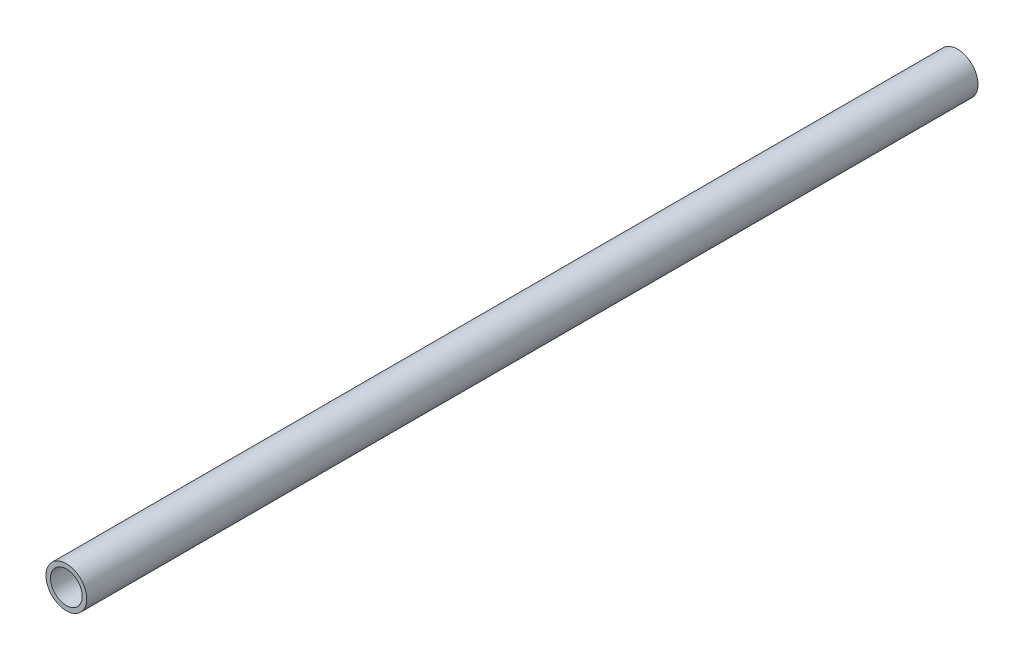
ISO-10303-21;
HEADER;
FILE_DESCRIPTION(('STEP AP214'),'2;1');
FILE_NAME('part.step','',(''),(''),'','','');
FILE_SCHEMA(('AUTOMOTIVE_DESIGN { 1 0 10303 214 1 1 1 1 }'));
ENDSEC;
DATA;
#1=APPLICATION_CONTEXT('core data for automotive mechanical design processes');
#2=APPLICATION_PROTOCOL_DEFINITION('international standard','automotive_design',2000,#1);
#3=PRODUCT_CONTEXT('',#1,'mechanical');
#4=PRODUCT('Part','Part','',(#3));
#5=PRODUCT_RELATED_PRODUCT_CATEGORY('part','',(#4));
#6=PRODUCT_DEFINITION_FORMATION('','',#4);
#7=PRODUCT_DEFINITION_CONTEXT('part definition',#1,'design');
#8=PRODUCT_DEFINITION('design','',#6,#7);
#9=PRODUCT_DEFINITION_SHAPE('','',#8);
#10=(LENGTH_UNIT() NAMED_UNIT(*) SI_UNIT(.MILLI.,.METRE.));
#11=(NAMED_UNIT(*) PLANE_ANGLE_UNIT() SI_UNIT($,.RADIAN.));
#12=(NAMED_UNIT(*) SI_UNIT($,.STERADIAN.) SOLID_ANGLE_UNIT());
#13=UNCERTAINTY_MEASURE_WITH_UNIT(LENGTH_MEASURE(1.E-05),#10,'distance_accuracy_value','');
#14=(GEOMETRIC_REPRESENTATION_CONTEXT(3) GLOBAL_UNCERTAINTY_ASSIGNED_CONTEXT((#13)) GLOBAL_UNIT_ASSIGNED_CONTEXT((#10,
#11,#12)) REPRESENTATION_CONTEXT('',''));
#15=CARTESIAN_POINT('',(0.,0.,0.));
#16=DIRECTION('',(0.,0.,1.));
#17=DIRECTION('',(1.,0.,0.));
#18=AXIS2_PLACEMENT_3D('',#15,#16,#17);
#19=CARTESIAN_POINT('',(0.,0.,393.26));
#20=DIRECTION('',(0.,0.,1.));
#21=DIRECTION('',(1.,0.,0.));
#22=AXIS2_PLACEMENT_3D('',#19,#20,#21);
#23=PLANE('',#22);
#24=CARTESIAN_POINT('',(0.,0.,393.26));
#25=DIRECTION('',(0.,0.,1.));
#26=DIRECTION('',(1.,0.,0.));
#27=AXIS2_PLACEMENT_3D('',#24,#25,#26);
#28=CIRCLE('',#27,9.);
#29=CARTESIAN_POINT('',(9.,0.,393.26));
#30=VERTEX_POINT('',#29);
#31=EDGE_CURVE('E10',#30,#30,#28,.T.);
#32=ORIENTED_EDGE('',*,*,#31,.T.);
#33=EDGE_LOOP('',(#32));
#34=FACE_BOUND('',#33,.T.);
#35=CARTESIAN_POINT('',(0.,0.,393.26));
#36=DIRECTION('',(0.,0.,1.));
#37=DIRECTION('',(1.,0.,0.));
#38=AXIS2_PLACEMENT_3D('',#35,#36,#37);
#39=CIRCLE('',#38,7.);
#40=CARTESIAN_POINT('',(7.,0.,393.26));
#41=VERTEX_POINT('',#40);
#42=EDGE_CURVE('E44',#41,#41,#39,.T.);
#43=ORIENTED_EDGE('',*,*,#42,.F.);
#44=EDGE_LOOP('',(#43));
#45=FACE_BOUND('',#44,.T.);
#46=ADVANCED_FACE('F33',(#34,#45),#23,.T.);
#47=CARTESIAN_POINT('',(0.,0.,0.));
#48=DIRECTION('',(0.,0.,1.));
#49=DIRECTION('',(1.,0.,0.));
#50=AXIS2_PLACEMENT_3D('',#47,#48,#49);
#51=PLANE('',#50);
#52=CARTESIAN_POINT('',(0.,0.,0.));
#53=DIRECTION('',(0.,0.,1.));
#54=DIRECTION('',(1.,0.,0.));
#55=AXIS2_PLACEMENT_3D('',#52,#53,#54);
#56=CIRCLE('',#55,9.);
#57=CARTESIAN_POINT('',(9.,0.,0.));
#58=VERTEX_POINT('',#57);
#59=EDGE_CURVE('E37',#58,#58,#56,.T.);
#60=ORIENTED_EDGE('',*,*,#59,.F.);
#61=EDGE_LOOP('',(#60));
#62=FACE_BOUND('',#61,.T.);
#63=CARTESIAN_POINT('',(0.,0.,0.));
#64=DIRECTION('',(0.,0.,1.));
#65=DIRECTION('',(1.,0.,0.));
#66=AXIS2_PLACEMENT_3D('',#63,#64,#65);
#67=CIRCLE('',#66,7.);
#68=CARTESIAN_POINT('',(7.,0.,0.));
#69=VERTEX_POINT('',#68);
#70=EDGE_CURVE('E46',#69,#69,#67,.T.);
#71=ORIENTED_EDGE('',*,*,#70,.T.);
#72=EDGE_LOOP('',(#71));
#73=FACE_BOUND('',#72,.T.);
#74=ADVANCED_FACE('F56',(#62,#73),#51,.F.);
#75=CARTESIAN_POINT('',(0.,0.,393.26));
#76=DIRECTION('',(0.,0.,-1.));
#77=DIRECTION('',(-1.,0.,0.));
#78=AXIS2_PLACEMENT_3D('',#75,#76,#77);
#79=CYLINDRICAL_SURFACE('',#78,9.);
#80=ORIENTED_EDGE('',*,*,#31,.F.);
#81=EDGE_LOOP('',(#80));
#82=FACE_BOUND('',#81,.T.);
#83=ORIENTED_EDGE('',*,*,#59,.T.);
#84=EDGE_LOOP('',(#83));
#85=FACE_BOUND('',#84,.T.);
#86=ADVANCED_FACE('F35',(#82,#85),#79,.T.);
#87=CARTESIAN_POINT('',(0.,0.,393.26));
#88=DIRECTION('',(0.,0.,-1.));
#89=DIRECTION('',(-1.,0.,0.));
#90=AXIS2_PLACEMENT_3D('',#87,#88,#89);
#91=CYLINDRICAL_SURFACE('',#90,7.);
#92=ORIENTED_EDGE('',*,*,#42,.T.);
#93=EDGE_LOOP('',(#92));
#94=FACE_BOUND('',#93,.T.);
#95=ORIENTED_EDGE('',*,*,#70,.F.);
#96=EDGE_LOOP('',(#95));
#97=FACE_BOUND('',#96,.T.);
#98=ADVANCED_FACE('F52',(#94,#97),#91,.F.);
#99=CLOSED_SHELL('',(#46,#74,#86,#98));
#100=MANIFOLD_SOLID_BREP('B2',#99);
#101=ADVANCED_BREP_SHAPE_REPRESENTATION('',(#18,#100),#14);
#102=SHAPE_DEFINITION_REPRESENTATION(#9,#101);
ENDSEC;
END-ISO-10303-21;
